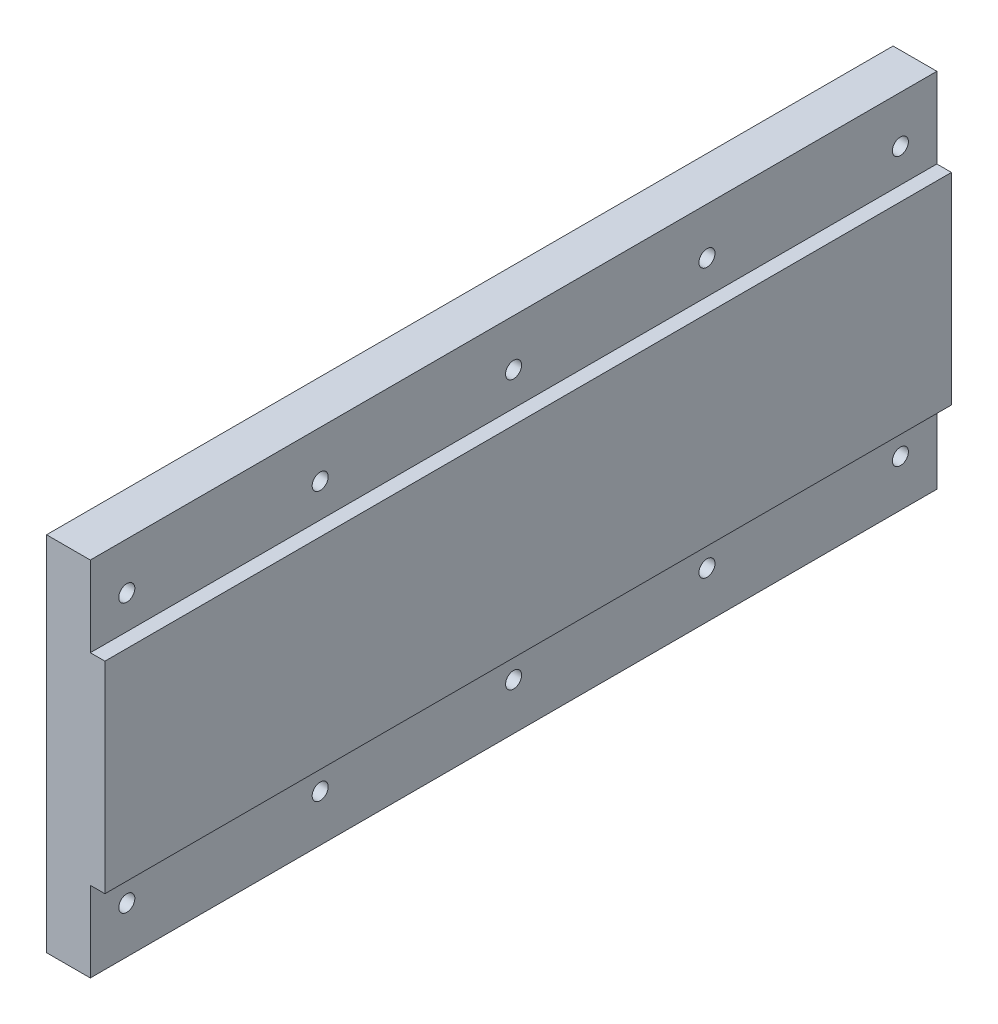
ISO-10303-21;
HEADER;
FILE_DESCRIPTION(('STEP AP214'),'2;1');
FILE_NAME('part.step','',(''),(''),'','','');
FILE_SCHEMA(('AUTOMOTIVE_DESIGN { 1 0 10303 214 1 1 1 1 }'));
ENDSEC;
DATA;
#1=APPLICATION_CONTEXT('core data for automotive mechanical design processes');
#2=APPLICATION_PROTOCOL_DEFINITION('international standard','automotive_design',2000,#1);
#3=PRODUCT_CONTEXT('',#1,'mechanical');
#4=PRODUCT('Part','Part','',(#3));
#5=PRODUCT_RELATED_PRODUCT_CATEGORY('part','',(#4));
#6=PRODUCT_DEFINITION_FORMATION('','',#4);
#7=PRODUCT_DEFINITION_CONTEXT('part definition',#1,'design');
#8=PRODUCT_DEFINITION('design','',#6,#7);
#9=PRODUCT_DEFINITION_SHAPE('','',#8);
#10=(LENGTH_UNIT() NAMED_UNIT(*) SI_UNIT(.MILLI.,.METRE.));
#11=(NAMED_UNIT(*) PLANE_ANGLE_UNIT() SI_UNIT($,.RADIAN.));
#12=(NAMED_UNIT(*) SI_UNIT($,.STERADIAN.) SOLID_ANGLE_UNIT());
#13=UNCERTAINTY_MEASURE_WITH_UNIT(LENGTH_MEASURE(1.E-05),#10,'distance_accuracy_value','');
#14=(GEOMETRIC_REPRESENTATION_CONTEXT(3) GLOBAL_UNCERTAINTY_ASSIGNED_CONTEXT((#13)) GLOBAL_UNIT_ASSIGNED_CONTEXT((#10,
#11,#12)) REPRESENTATION_CONTEXT('',''));
#15=CARTESIAN_POINT('',(0.,0.,0.));
#16=DIRECTION('',(0.,0.,1.));
#17=DIRECTION('',(1.,0.,0.));
#18=AXIS2_PLACEMENT_3D('',#15,#16,#17);
#19=CARTESIAN_POINT('',(0.,159.287393315112,290.));
#20=DIRECTION('',(0.,-1.,0.));
#21=DIRECTION('',(1.,0.,0.));
#22=AXIS2_PLACEMENT_3D('',#19,#20,#21);
#23=PLANE('',#22);
#24=DIRECTION('',(-1.,0.,0.));
#25=VECTOR('',#24,1.);
#26=CARTESIAN_POINT('',(0.,159.287393315112,-290.));
#27=LINE('',#26,#25);
#28=CARTESIAN_POINT('',(0.,159.287393315112,-290.));
#29=VERTEX_POINT('',#28);
#30=CARTESIAN_POINT('',(-30.,159.287393315112,-290.));
#31=VERTEX_POINT('',#30);
#32=EDGE_CURVE('E148',#29,#31,#27,.T.);
#33=ORIENTED_EDGE('',*,*,#32,.T.);
#34=DIRECTION('',(0.,0.,-1.));
#35=VECTOR('',#34,1.);
#36=CARTESIAN_POINT('',(-30.,159.287393315112,290.));
#37=LINE('',#36,#35);
#38=CARTESIAN_POINT('',(-30.,159.287393315112,290.));
#39=VERTEX_POINT('',#38);
#40=EDGE_CURVE('E11',#39,#31,#37,.T.);
#41=ORIENTED_EDGE('',*,*,#40,.F.);
#42=DIRECTION('',(-1.,0.,0.));
#43=VECTOR('',#42,1.);
#44=CARTESIAN_POINT('',(0.,159.287393315112,290.));
#45=LINE('',#44,#43);
#46=CARTESIAN_POINT('',(0.,159.287393315112,290.));
#47=VERTEX_POINT('',#46);
#48=EDGE_CURVE('E171',#47,#39,#45,.T.);
#49=ORIENTED_EDGE('',*,*,#48,.F.);
#50=DIRECTION('',(0.,0.,-1.));
#51=VECTOR('',#50,1.);
#52=CARTESIAN_POINT('',(0.,159.287393315112,290.));
#53=LINE('',#52,#51);
#54=EDGE_CURVE('E144',#47,#29,#53,.T.);
#55=ORIENTED_EDGE('',*,*,#54,.T.);
#56=EDGE_LOOP('',(#33,#41,#49,#55));
#57=FACE_BOUND('',#56,.T.);
#58=ADVANCED_FACE('F47',(#57),#23,.F.);
#59=CARTESIAN_POINT('',(-30.,159.287393315112,290.));
#60=DIRECTION('',(1.,0.,0.));
#61=DIRECTION('',(0.,1.,0.));
#62=AXIS2_PLACEMENT_3D('',#59,#60,#61);
#63=PLANE('',#62);
#64=CARTESIAN_POINT('',(-30.,127.287393315112,-265.));
#65=DIRECTION('',(-1.,0.,0.));
#66=DIRECTION('',(0.,0.,1.));
#67=AXIS2_PLACEMENT_3D('',#64,#65,#66);
#68=CIRCLE('',#67,11.5);
#69=CARTESIAN_POINT('',(-30.,127.287393315112,-253.5));
#70=VERTEX_POINT('',#69);
#71=EDGE_CURVE('E330',#70,#70,#68,.T.);
#72=ORIENTED_EDGE('',*,*,#71,.F.);
#73=EDGE_LOOP('',(#72));
#74=FACE_BOUND('',#73,.T.);
#75=CARTESIAN_POINT('',(-30.,127.287393315112,-132.5));
#76=DIRECTION('',(-1.,0.,0.));
#77=DIRECTION('',(0.,0.,1.));
#78=AXIS2_PLACEMENT_3D('',#75,#76,#77);
#79=CIRCLE('',#78,11.5);
#80=CARTESIAN_POINT('',(-30.,127.287393315112,-121.));
#81=VERTEX_POINT('',#80);
#82=EDGE_CURVE('E318',#81,#81,#79,.T.);
#83=ORIENTED_EDGE('',*,*,#82,.F.);
#84=EDGE_LOOP('',(#83));
#85=FACE_BOUND('',#84,.T.);
#86=CARTESIAN_POINT('',(-30.,127.287393315112,0.));
#87=DIRECTION('',(-1.,0.,0.));
#88=DIRECTION('',(0.,0.,1.));
#89=AXIS2_PLACEMENT_3D('',#86,#87,#88);
#90=CIRCLE('',#89,11.5);
#91=CARTESIAN_POINT('',(-30.,127.287393315112,11.5000000000001));
#92=VERTEX_POINT('',#91);
#93=EDGE_CURVE('E306',#92,#92,#90,.T.);
#94=ORIENTED_EDGE('',*,*,#93,.F.);
#95=EDGE_LOOP('',(#94));
#96=FACE_BOUND('',#95,.T.);
#97=CARTESIAN_POINT('',(-30.,127.287393315112,132.5));
#98=DIRECTION('',(-1.,0.,0.));
#99=DIRECTION('',(0.,0.,1.));
#100=AXIS2_PLACEMENT_3D('',#97,#98,#99);
#101=CIRCLE('',#100,11.5);
#102=CARTESIAN_POINT('',(-30.,127.287393315112,144.));
#103=VERTEX_POINT('',#102);
#104=EDGE_CURVE('E294',#103,#103,#101,.T.);
#105=ORIENTED_EDGE('',*,*,#104,.F.);
#106=EDGE_LOOP('',(#105));
#107=FACE_BOUND('',#106,.T.);
#108=CARTESIAN_POINT('',(-30.,127.287393315112,265.));
#109=DIRECTION('',(-1.,0.,0.));
#110=DIRECTION('',(0.,0.,1.));
#111=AXIS2_PLACEMENT_3D('',#108,#109,#110);
#112=CIRCLE('',#111,11.5);
#113=CARTESIAN_POINT('',(-30.,127.287393315112,276.5));
#114=VERTEX_POINT('',#113);
#115=EDGE_CURVE('E282',#114,#114,#112,.T.);
#116=ORIENTED_EDGE('',*,*,#115,.F.);
#117=EDGE_LOOP('',(#116));
#118=FACE_BOUND('',#117,.T.);
#119=CARTESIAN_POINT('',(-30.,-56.7126066848881,265.));
#120=DIRECTION('',(-1.,0.,0.));
#121=DIRECTION('',(0.,0.,1.));
#122=AXIS2_PLACEMENT_3D('',#119,#120,#121);
#123=CIRCLE('',#122,11.5);
#124=CARTESIAN_POINT('',(-30.,-56.7126066848881,276.5));
#125=VERTEX_POINT('',#124);
#126=EDGE_CURVE('E270',#125,#125,#123,.T.);
#127=ORIENTED_EDGE('',*,*,#126,.F.);
#128=EDGE_LOOP('',(#127));
#129=FACE_BOUND('',#128,.T.);
#130=CARTESIAN_POINT('',(-30.,-56.7126066848881,132.5));
#131=DIRECTION('',(-1.,0.,0.));
#132=DIRECTION('',(0.,0.,1.));
#133=AXIS2_PLACEMENT_3D('',#130,#131,#132);
#134=CIRCLE('',#133,11.5);
#135=CARTESIAN_POINT('',(-30.,-56.7126066848881,144.));
#136=VERTEX_POINT('',#135);
#137=EDGE_CURVE('E258',#136,#136,#134,.T.);
#138=ORIENTED_EDGE('',*,*,#137,.F.);
#139=EDGE_LOOP('',(#138));
#140=FACE_BOUND('',#139,.T.);
#141=CARTESIAN_POINT('',(-30.,-56.7126066848881,0.));
#142=DIRECTION('',(-1.,0.,0.));
#143=DIRECTION('',(0.,0.,1.));
#144=AXIS2_PLACEMENT_3D('',#141,#142,#143);
#145=CIRCLE('',#144,11.5);
#146=CARTESIAN_POINT('',(-30.,-56.7126066848881,11.5000000000001));
#147=VERTEX_POINT('',#146);
#148=EDGE_CURVE('E246',#147,#147,#145,.T.);
#149=ORIENTED_EDGE('',*,*,#148,.F.);
#150=EDGE_LOOP('',(#149));
#151=FACE_BOUND('',#150,.T.);
#152=CARTESIAN_POINT('',(-30.,-56.7126066848881,-132.5));
#153=DIRECTION('',(-1.,0.,0.));
#154=DIRECTION('',(0.,0.,1.));
#155=AXIS2_PLACEMENT_3D('',#152,#153,#154);
#156=CIRCLE('',#155,11.5);
#157=CARTESIAN_POINT('',(-30.,-56.7126066848881,-121.));
#158=VERTEX_POINT('',#157);
#159=EDGE_CURVE('E234',#158,#158,#156,.T.);
#160=ORIENTED_EDGE('',*,*,#159,.F.);
#161=EDGE_LOOP('',(#160));
#162=FACE_BOUND('',#161,.T.);
#163=CARTESIAN_POINT('',(-30.,-56.7126066848881,-265.));
#164=DIRECTION('',(-1.,0.,0.));
#165=DIRECTION('',(0.,0.,1.));
#166=AXIS2_PLACEMENT_3D('',#163,#164,#165);
#167=CIRCLE('',#166,11.5);
#168=CARTESIAN_POINT('',(-30.,-56.7126066848881,-253.5));
#169=VERTEX_POINT('',#168);
#170=EDGE_CURVE('E222',#169,#169,#167,.T.);
#171=ORIENTED_EDGE('',*,*,#170,.F.);
#172=EDGE_LOOP('',(#171));
#173=FACE_BOUND('',#172,.T.);
#174=DIRECTION('',(0.,-1.,0.));
#175=VECTOR('',#174,1.);
#176=CARTESIAN_POINT('',(-30.,159.287393315112,-290.));
#177=LINE('',#176,#175);
#178=CARTESIAN_POINT('',(-30.,-88.7126066848881,-290.));
#179=VERTEX_POINT('',#178);
#180=EDGE_CURVE('E152',#31,#179,#177,.T.);
#181=ORIENTED_EDGE('',*,*,#180,.T.);
#182=DIRECTION('',(0.,0.,-1.));
#183=VECTOR('',#182,1.);
#184=CARTESIAN_POINT('',(-30.,-88.7126066848881,290.));
#185=LINE('',#184,#183);
#186=CARTESIAN_POINT('',(-30.,-88.7126066848881,290.));
#187=VERTEX_POINT('',#186);
#188=EDGE_CURVE('E56',#187,#179,#185,.T.);
#189=ORIENTED_EDGE('',*,*,#188,.F.);
#190=DIRECTION('',(0.,-1.,0.));
#191=VECTOR('',#190,1.);
#192=CARTESIAN_POINT('',(-30.,159.287393315112,290.));
#193=LINE('',#192,#191);
#194=EDGE_CURVE('E107',#39,#187,#193,.T.);
#195=ORIENTED_EDGE('',*,*,#194,.F.);
#196=ORIENTED_EDGE('',*,*,#40,.T.);
#197=EDGE_LOOP('',(#181,#189,#195,#196));
#198=FACE_BOUND('',#197,.T.);
#199=ADVANCED_FACE('F337',(#74,#85,#96,#107,#118,#129,#140,#151,#162,#173,#198),#63,.F.);
#200=CARTESIAN_POINT('',(-30.,-88.7126066848881,290.));
#201=DIRECTION('',(0.,1.,0.));
#202=DIRECTION('',(-1.,0.,0.));
#203=AXIS2_PLACEMENT_3D('',#200,#201,#202);
#204=PLANE('',#203);
#205=DIRECTION('',(1.,0.,0.));
#206=VECTOR('',#205,1.);
#207=CARTESIAN_POINT('',(-30.,-88.7126066848881,-290.));
#208=LINE('',#207,#206);
#209=CARTESIAN_POINT('',(0.,-88.712606684888,-290.));
#210=VERTEX_POINT('',#209);
#211=EDGE_CURVE('E156',#179,#210,#208,.T.);
#212=ORIENTED_EDGE('',*,*,#211,.T.);
#213=DIRECTION('',(0.,0.,-1.));
#214=VECTOR('',#213,1.);
#215=CARTESIAN_POINT('',(0.,-88.712606684888,290.));
#216=LINE('',#215,#214);
#217=CARTESIAN_POINT('',(0.,-88.712606684888,290.));
#218=VERTEX_POINT('',#217);
#219=EDGE_CURVE('E182',#218,#210,#216,.T.);
#220=ORIENTED_EDGE('',*,*,#219,.F.);
#221=DIRECTION('',(1.,0.,0.));
#222=VECTOR('',#221,1.);
#223=CARTESIAN_POINT('',(-30.,-88.7126066848881,290.));
#224=LINE('',#223,#222);
#225=EDGE_CURVE('E192',#187,#218,#224,.T.);
#226=ORIENTED_EDGE('',*,*,#225,.F.);
#227=ORIENTED_EDGE('',*,*,#188,.T.);
#228=EDGE_LOOP('',(#212,#220,#226,#227));
#229=FACE_BOUND('',#228,.T.);
#230=ADVANCED_FACE('F190',(#229),#204,.F.);
#231=CARTESIAN_POINT('',(0.,-88.712606684888,290.));
#232=DIRECTION('',(-1.,0.,0.));
#233=DIRECTION('',(0.,0.,1.));
#234=AXIS2_PLACEMENT_3D('',#231,#232,#233);
#235=PLANE('',#234);
#236=CARTESIAN_POINT('',(0.,-56.7126066848881,265.));
#237=DIRECTION('',(-1.,0.,0.));
#238=DIRECTION('',(0.,0.,1.));
#239=AXIS2_PLACEMENT_3D('',#236,#237,#238);
#240=CIRCLE('',#239,5.49999999999998);
#241=CARTESIAN_POINT('',(0.,-56.7126066848881,270.5));
#242=VERTEX_POINT('',#241);
#243=EDGE_CURVE('E262',#242,#242,#240,.T.);
#244=ORIENTED_EDGE('',*,*,#243,.T.);
#245=EDGE_LOOP('',(#244));
#246=FACE_BOUND('',#245,.T.);
#247=CARTESIAN_POINT('',(0.,-56.7126066848881,132.5));
#248=DIRECTION('',(-1.,0.,0.));
#249=DIRECTION('',(0.,0.,1.));
#250=AXIS2_PLACEMENT_3D('',#247,#248,#249);
#251=CIRCLE('',#250,5.49999999999998);
#252=CARTESIAN_POINT('',(0.,-56.7126066848881,138.));
#253=VERTEX_POINT('',#252);
#254=EDGE_CURVE('E250',#253,#253,#251,.T.);
#255=ORIENTED_EDGE('',*,*,#254,.T.);
#256=EDGE_LOOP('',(#255));
#257=FACE_BOUND('',#256,.T.);
#258=CARTESIAN_POINT('',(0.,-56.7126066848881,0.));
#259=DIRECTION('',(-1.,0.,0.));
#260=DIRECTION('',(0.,0.,1.));
#261=AXIS2_PLACEMENT_3D('',#258,#259,#260);
#262=CIRCLE('',#261,5.49999999999998);
#263=CARTESIAN_POINT('',(0.,-56.7126066848881,5.50000000000004));
#264=VERTEX_POINT('',#263);
#265=EDGE_CURVE('E238',#264,#264,#262,.T.);
#266=ORIENTED_EDGE('',*,*,#265,.T.);
#267=EDGE_LOOP('',(#266));
#268=FACE_BOUND('',#267,.T.);
#269=CARTESIAN_POINT('',(0.,-56.7126066848881,-132.5));
#270=DIRECTION('',(-1.,0.,0.));
#271=DIRECTION('',(0.,0.,1.));
#272=AXIS2_PLACEMENT_3D('',#269,#270,#271);
#273=CIRCLE('',#272,5.49999999999998);
#274=CARTESIAN_POINT('',(0.,-56.7126066848881,-127.));
#275=VERTEX_POINT('',#274);
#276=EDGE_CURVE('E226',#275,#275,#273,.T.);
#277=ORIENTED_EDGE('',*,*,#276,.T.);
#278=EDGE_LOOP('',(#277));
#279=FACE_BOUND('',#278,.T.);
#280=CARTESIAN_POINT('',(0.,-56.7126066848881,-265.));
#281=DIRECTION('',(-1.,0.,0.));
#282=DIRECTION('',(0.,0.,1.));
#283=AXIS2_PLACEMENT_3D('',#280,#281,#282);
#284=CIRCLE('',#283,5.49999999999998);
#285=CARTESIAN_POINT('',(0.,-56.7126066848881,-259.5));
#286=VERTEX_POINT('',#285);
#287=EDGE_CURVE('E153',#286,#286,#284,.T.);
#288=ORIENTED_EDGE('',*,*,#287,.T.);
#289=EDGE_LOOP('',(#288));
#290=FACE_BOUND('',#289,.T.);
#291=DIRECTION('',(0.,1.,0.));
#292=VECTOR('',#291,1.);
#293=CARTESIAN_POINT('',(0.,-88.712606684888,-290.));
#294=LINE('',#293,#292);
#295=CARTESIAN_POINT('',(0.,-33.7126066848881,-290.));
#296=VERTEX_POINT('',#295);
#297=EDGE_CURVE('E159',#210,#296,#294,.T.);
#298=ORIENTED_EDGE('',*,*,#297,.T.);
#299=DIRECTION('',(0.,0.,-1.));
#300=VECTOR('',#299,1.);
#301=CARTESIAN_POINT('',(0.,-33.7126066848881,290.));
#302=LINE('',#301,#300);
#303=CARTESIAN_POINT('',(0.,-33.7126066848881,290.));
#304=VERTEX_POINT('',#303);
#305=EDGE_CURVE('E178',#304,#296,#302,.T.);
#306=ORIENTED_EDGE('',*,*,#305,.F.);
#307=DIRECTION('',(0.,1.,0.));
#308=VECTOR('',#307,1.);
#309=CARTESIAN_POINT('',(0.,-88.712606684888,290.));
#310=LINE('',#309,#308);
#311=EDGE_CURVE('E205',#218,#304,#310,.T.);
#312=ORIENTED_EDGE('',*,*,#311,.F.);
#313=ORIENTED_EDGE('',*,*,#219,.T.);
#314=EDGE_LOOP('',(#298,#306,#312,#313));
#315=FACE_BOUND('',#314,.T.);
#316=ADVANCED_FACE('F200',(#246,#257,#268,#279,#290,#315),#235,.F.);
#317=CARTESIAN_POINT('',(0.,-33.7126066848881,290.));
#318=DIRECTION('',(0.,1.,0.));
#319=DIRECTION('',(-1.,0.,0.));
#320=AXIS2_PLACEMENT_3D('',#317,#318,#319);
#321=PLANE('',#320);
#322=DIRECTION('',(1.,0.,0.));
#323=VECTOR('',#322,1.);
#324=CARTESIAN_POINT('',(0.,-33.7126066848881,-290.));
#325=LINE('',#324,#323);
#326=CARTESIAN_POINT('',(10.,-33.7126066848881,-290.));
#327=VERTEX_POINT('',#326);
#328=EDGE_CURVE('E162',#296,#327,#325,.T.);
#329=ORIENTED_EDGE('',*,*,#328,.T.);
#330=DIRECTION('',(0.,0.,-1.));
#331=VECTOR('',#330,1.);
#332=CARTESIAN_POINT('',(10.,-33.7126066848881,290.));
#333=LINE('',#332,#331);
#334=CARTESIAN_POINT('',(10.,-33.7126066848881,290.));
#335=VERTEX_POINT('',#334);
#336=EDGE_CURVE('E137',#335,#327,#333,.T.);
#337=ORIENTED_EDGE('',*,*,#336,.F.);
#338=DIRECTION('',(1.,0.,0.));
#339=VECTOR('',#338,1.);
#340=CARTESIAN_POINT('',(0.,-33.7126066848881,290.));
#341=LINE('',#340,#339);
#342=EDGE_CURVE('E126',#304,#335,#341,.T.);
#343=ORIENTED_EDGE('',*,*,#342,.F.);
#344=ORIENTED_EDGE('',*,*,#305,.T.);
#345=EDGE_LOOP('',(#329,#337,#343,#344));
#346=FACE_BOUND('',#345,.T.);
#347=ADVANCED_FACE('F203',(#346),#321,.F.);
#348=CARTESIAN_POINT('',(10.,-33.7126066848881,290.));
#349=DIRECTION('',(-1.,0.,0.));
#350=DIRECTION('',(0.,0.,1.));
#351=AXIS2_PLACEMENT_3D('',#348,#349,#350);
#352=PLANE('',#351);
#353=DIRECTION('',(0.,1.,0.));
#354=VECTOR('',#353,1.);
#355=CARTESIAN_POINT('',(10.,-33.7126066848881,-290.));
#356=LINE('',#355,#354);
#357=CARTESIAN_POINT('',(10.,104.287393315112,-290.));
#358=VERTEX_POINT('',#357);
#359=EDGE_CURVE('E135',#327,#358,#356,.T.);
#360=ORIENTED_EDGE('',*,*,#359,.T.);
#361=DIRECTION('',(0.,0.,-1.));
#362=VECTOR('',#361,1.);
#363=CARTESIAN_POINT('',(10.,104.287393315112,290.));
#364=LINE('',#363,#362);
#365=CARTESIAN_POINT('',(10.,104.287393315112,290.));
#366=VERTEX_POINT('',#365);
#367=EDGE_CURVE('E132',#366,#358,#364,.T.);
#368=ORIENTED_EDGE('',*,*,#367,.F.);
#369=DIRECTION('',(0.,1.,0.));
#370=VECTOR('',#369,1.);
#371=CARTESIAN_POINT('',(10.,-33.7126066848881,290.));
#372=LINE('',#371,#370);
#373=EDGE_CURVE('E120',#335,#366,#372,.T.);
#374=ORIENTED_EDGE('',*,*,#373,.F.);
#375=ORIENTED_EDGE('',*,*,#336,.T.);
#376=EDGE_LOOP('',(#360,#368,#374,#375));
#377=FACE_BOUND('',#376,.T.);
#378=ADVANCED_FACE('F133',(#377),#352,.F.);
#379=CARTESIAN_POINT('',(10.,104.287393315112,290.));
#380=DIRECTION('',(0.,-1.,0.));
#381=DIRECTION('',(1.,0.,0.));
#382=AXIS2_PLACEMENT_3D('',#379,#380,#381);
#383=PLANE('',#382);
#384=DIRECTION('',(-1.,0.,0.));
#385=VECTOR('',#384,1.);
#386=CARTESIAN_POINT('',(10.,104.287393315112,-290.));
#387=LINE('',#386,#385);
#388=CARTESIAN_POINT('',(0.,104.287393315112,-290.));
#389=VERTEX_POINT('',#388);
#390=EDGE_CURVE('E93',#358,#389,#387,.T.);
#391=ORIENTED_EDGE('',*,*,#390,.T.);
#392=DIRECTION('',(0.,0.,-1.));
#393=VECTOR('',#392,1.);
#394=CARTESIAN_POINT('',(0.,104.287393315112,290.));
#395=LINE('',#394,#393);
#396=CARTESIAN_POINT('',(0.,104.287393315112,290.));
#397=VERTEX_POINT('',#396);
#398=EDGE_CURVE('E138',#397,#389,#395,.T.);
#399=ORIENTED_EDGE('',*,*,#398,.F.);
#400=DIRECTION('',(-1.,0.,0.));
#401=VECTOR('',#400,1.);
#402=CARTESIAN_POINT('',(10.,104.287393315112,290.));
#403=LINE('',#402,#401);
#404=EDGE_CURVE('E124',#366,#397,#403,.T.);
#405=ORIENTED_EDGE('',*,*,#404,.F.);
#406=ORIENTED_EDGE('',*,*,#367,.T.);
#407=EDGE_LOOP('',(#391,#399,#405,#406));
#408=FACE_BOUND('',#407,.T.);
#409=ADVANCED_FACE('F140',(#408),#383,.F.);
#410=CARTESIAN_POINT('',(0.,104.287393315112,290.));
#411=DIRECTION('',(-1.,0.,0.));
#412=DIRECTION('',(0.,0.,1.));
#413=AXIS2_PLACEMENT_3D('',#410,#411,#412);
#414=PLANE('',#413);
#415=CARTESIAN_POINT('',(0.,127.287393315112,-265.));
#416=DIRECTION('',(-1.,0.,0.));
#417=DIRECTION('',(0.,0.,1.));
#418=AXIS2_PLACEMENT_3D('',#415,#416,#417);
#419=CIRCLE('',#418,5.49999999999998);
#420=CARTESIAN_POINT('',(0.,127.287393315112,-259.5));
#421=VERTEX_POINT('',#420);
#422=EDGE_CURVE('E322',#421,#421,#419,.T.);
#423=ORIENTED_EDGE('',*,*,#422,.T.);
#424=EDGE_LOOP('',(#423));
#425=FACE_BOUND('',#424,.T.);
#426=CARTESIAN_POINT('',(0.,127.287393315112,-132.5));
#427=DIRECTION('',(-1.,0.,0.));
#428=DIRECTION('',(0.,0.,1.));
#429=AXIS2_PLACEMENT_3D('',#426,#427,#428);
#430=CIRCLE('',#429,5.49999999999998);
#431=CARTESIAN_POINT('',(0.,127.287393315112,-127.));
#432=VERTEX_POINT('',#431);
#433=EDGE_CURVE('E310',#432,#432,#430,.T.);
#434=ORIENTED_EDGE('',*,*,#433,.T.);
#435=EDGE_LOOP('',(#434));
#436=FACE_BOUND('',#435,.T.);
#437=CARTESIAN_POINT('',(0.,127.287393315112,0.));
#438=DIRECTION('',(-1.,0.,0.));
#439=DIRECTION('',(0.,0.,1.));
#440=AXIS2_PLACEMENT_3D('',#437,#438,#439);
#441=CIRCLE('',#440,5.49999999999998);
#442=CARTESIAN_POINT('',(0.,127.287393315112,5.50000000000003));
#443=VERTEX_POINT('',#442);
#444=EDGE_CURVE('E298',#443,#443,#441,.T.);
#445=ORIENTED_EDGE('',*,*,#444,.T.);
#446=EDGE_LOOP('',(#445));
#447=FACE_BOUND('',#446,.T.);
#448=CARTESIAN_POINT('',(0.,127.287393315112,132.5));
#449=DIRECTION('',(-1.,0.,0.));
#450=DIRECTION('',(0.,0.,1.));
#451=AXIS2_PLACEMENT_3D('',#448,#449,#450);
#452=CIRCLE('',#451,5.49999999999998);
#453=CARTESIAN_POINT('',(0.,127.287393315112,138.));
#454=VERTEX_POINT('',#453);
#455=EDGE_CURVE('E286',#454,#454,#452,.T.);
#456=ORIENTED_EDGE('',*,*,#455,.T.);
#457=EDGE_LOOP('',(#456));
#458=FACE_BOUND('',#457,.T.);
#459=CARTESIAN_POINT('',(0.,127.287393315112,265.));
#460=DIRECTION('',(-1.,0.,0.));
#461=DIRECTION('',(0.,0.,1.));
#462=AXIS2_PLACEMENT_3D('',#459,#460,#461);
#463=CIRCLE('',#462,5.49999999999998);
#464=CARTESIAN_POINT('',(0.,127.287393315112,270.5));
#465=VERTEX_POINT('',#464);
#466=EDGE_CURVE('E274',#465,#465,#463,.T.);
#467=ORIENTED_EDGE('',*,*,#466,.T.);
#468=EDGE_LOOP('',(#467));
#469=FACE_BOUND('',#468,.T.);
#470=DIRECTION('',(0.,1.,0.));
#471=VECTOR('',#470,1.);
#472=CARTESIAN_POINT('',(0.,104.287393315112,-290.));
#473=LINE('',#472,#471);
#474=EDGE_CURVE('E99',#389,#29,#473,.T.);
#475=ORIENTED_EDGE('',*,*,#474,.T.);
#476=ORIENTED_EDGE('',*,*,#54,.F.);
#477=DIRECTION('',(0.,1.,0.));
#478=VECTOR('',#477,1.);
#479=CARTESIAN_POINT('',(0.,104.287393315112,290.));
#480=LINE('',#479,#478);
#481=EDGE_CURVE('E64',#397,#47,#480,.T.);
#482=ORIENTED_EDGE('',*,*,#481,.F.);
#483=ORIENTED_EDGE('',*,*,#398,.T.);
#484=EDGE_LOOP('',(#475,#476,#482,#483));
#485=FACE_BOUND('',#484,.T.);
#486=ADVANCED_FACE('F360',(#425,#436,#447,#458,#469,#485),#414,.F.);
#487=CARTESIAN_POINT('',(0.,0.,290.));
#488=DIRECTION('',(0.,0.,1.));
#489=DIRECTION('',(1.,0.,0.));
#490=AXIS2_PLACEMENT_3D('',#487,#488,#489);
#491=PLANE('',#490);
#492=ORIENTED_EDGE('',*,*,#48,.T.);
#493=ORIENTED_EDGE('',*,*,#194,.T.);
#494=ORIENTED_EDGE('',*,*,#225,.T.);
#495=ORIENTED_EDGE('',*,*,#311,.T.);
#496=ORIENTED_EDGE('',*,*,#342,.T.);
#497=ORIENTED_EDGE('',*,*,#373,.T.);
#498=ORIENTED_EDGE('',*,*,#404,.T.);
#499=ORIENTED_EDGE('',*,*,#481,.T.);
#500=EDGE_LOOP('',(#492,#493,#494,#495,#496,#497,#498,#499));
#501=FACE_BOUND('',#500,.T.);
#502=ADVANCED_FACE('F122',(#501),#491,.T.);
#503=CARTESIAN_POINT('',(0.,0.,-290.));
#504=DIRECTION('',(0.,0.,1.));
#505=DIRECTION('',(1.,0.,0.));
#506=AXIS2_PLACEMENT_3D('',#503,#504,#505);
#507=PLANE('',#506);
#508=ORIENTED_EDGE('',*,*,#32,.F.);
#509=ORIENTED_EDGE('',*,*,#474,.F.);
#510=ORIENTED_EDGE('',*,*,#390,.F.);
#511=ORIENTED_EDGE('',*,*,#359,.F.);
#512=ORIENTED_EDGE('',*,*,#328,.F.);
#513=ORIENTED_EDGE('',*,*,#297,.F.);
#514=ORIENTED_EDGE('',*,*,#211,.F.);
#515=ORIENTED_EDGE('',*,*,#180,.F.);
#516=EDGE_LOOP('',(#508,#509,#510,#511,#512,#513,#514,#515));
#517=FACE_BOUND('',#516,.T.);
#518=ADVANCED_FACE('F196',(#517),#507,.F.);
#519=CARTESIAN_POINT('',(-30.,-56.7126066848881,-265.));
#520=DIRECTION('',(-1.,0.,0.));
#521=DIRECTION('',(0.,0.,1.));
#522=AXIS2_PLACEMENT_3D('',#519,#520,#521);
#523=CYLINDRICAL_SURFACE('',#522,5.49999999999999);
#524=ORIENTED_EDGE('',*,*,#287,.F.);
#525=EDGE_LOOP('',(#524));
#526=FACE_BOUND('',#525,.T.);
#527=CARTESIAN_POINT('',(-24.,-56.7126066848881,-265.));
#528=DIRECTION('',(-1.,0.,0.));
#529=DIRECTION('',(0.,0.,1.));
#530=AXIS2_PLACEMENT_3D('',#527,#528,#529);
#531=CIRCLE('',#530,5.5);
#532=CARTESIAN_POINT('',(-24.,-56.7126066848881,-259.5));
#533=VERTEX_POINT('',#532);
#534=EDGE_CURVE('E218',#533,#533,#531,.T.);
#535=ORIENTED_EDGE('',*,*,#534,.T.);
#536=EDGE_LOOP('',(#535));
#537=FACE_BOUND('',#536,.T.);
#538=ADVANCED_FACE('F416',(#526,#537),#523,.F.);
#539=CARTESIAN_POINT('',(-30.,-56.7126066848881,-265.));
#540=DIRECTION('',(-1.,0.,0.));
#541=DIRECTION('',(0.,0.,1.));
#542=AXIS2_PLACEMENT_3D('',#539,#540,#541);
#543=CONICAL_SURFACE('',#542,11.5,0.785398163397449);
#544=ORIENTED_EDGE('',*,*,#534,.F.);
#545=EDGE_LOOP('',(#544));
#546=FACE_BOUND('',#545,.T.);
#547=ORIENTED_EDGE('',*,*,#170,.T.);
#548=EDGE_LOOP('',(#547));
#549=FACE_BOUND('',#548,.T.);
#550=ADVANCED_FACE('F445',(#546,#549),#543,.F.);
#551=CARTESIAN_POINT('',(-30.,-56.7126066848881,-132.5));
#552=DIRECTION('',(-1.,0.,0.));
#553=DIRECTION('',(0.,0.,1.));
#554=AXIS2_PLACEMENT_3D('',#551,#552,#553);
#555=CYLINDRICAL_SURFACE('',#554,5.49999999999999);
#556=ORIENTED_EDGE('',*,*,#276,.F.);
#557=EDGE_LOOP('',(#556));
#558=FACE_BOUND('',#557,.T.);
#559=CARTESIAN_POINT('',(-24.,-56.7126066848881,-132.5));
#560=DIRECTION('',(-1.,0.,0.));
#561=DIRECTION('',(0.,0.,1.));
#562=AXIS2_PLACEMENT_3D('',#559,#560,#561);
#563=CIRCLE('',#562,5.5);
#564=CARTESIAN_POINT('',(-24.,-56.7126066848881,-127.));
#565=VERTEX_POINT('',#564);
#566=EDGE_CURVE('E230',#565,#565,#563,.T.);
#567=ORIENTED_EDGE('',*,*,#566,.T.);
#568=EDGE_LOOP('',(#567));
#569=FACE_BOUND('',#568,.T.);
#570=ADVANCED_FACE('F454',(#558,#569),#555,.F.);
#571=CARTESIAN_POINT('',(-30.,-56.7126066848881,-132.5));
#572=DIRECTION('',(-1.,0.,0.));
#573=DIRECTION('',(0.,0.,1.));
#574=AXIS2_PLACEMENT_3D('',#571,#572,#573);
#575=CONICAL_SURFACE('',#574,11.5,0.785398163397449);
#576=ORIENTED_EDGE('',*,*,#566,.F.);
#577=EDGE_LOOP('',(#576));
#578=FACE_BOUND('',#577,.T.);
#579=ORIENTED_EDGE('',*,*,#159,.T.);
#580=EDGE_LOOP('',(#579));
#581=FACE_BOUND('',#580,.T.);
#582=ADVANCED_FACE('F463',(#578,#581),#575,.F.);
#583=CARTESIAN_POINT('',(-30.,-56.7126066848881,0.));
#584=DIRECTION('',(-1.,0.,0.));
#585=DIRECTION('',(0.,0.,1.));
#586=AXIS2_PLACEMENT_3D('',#583,#584,#585);
#587=CYLINDRICAL_SURFACE('',#586,5.49999999999999);
#588=ORIENTED_EDGE('',*,*,#265,.F.);
#589=EDGE_LOOP('',(#588));
#590=FACE_BOUND('',#589,.T.);
#591=CARTESIAN_POINT('',(-24.,-56.7126066848881,0.));
#592=DIRECTION('',(-1.,0.,0.));
#593=DIRECTION('',(0.,0.,1.));
#594=AXIS2_PLACEMENT_3D('',#591,#592,#593);
#595=CIRCLE('',#594,5.5);
#596=CARTESIAN_POINT('',(-24.,-56.7126066848881,5.50000000000005));
#597=VERTEX_POINT('',#596);
#598=EDGE_CURVE('E242',#597,#597,#595,.T.);
#599=ORIENTED_EDGE('',*,*,#598,.T.);
#600=EDGE_LOOP('',(#599));
#601=FACE_BOUND('',#600,.T.);
#602=ADVANCED_FACE('F472',(#590,#601),#587,.F.);
#603=CARTESIAN_POINT('',(-30.,-56.7126066848881,0.));
#604=DIRECTION('',(-1.,0.,0.));
#605=DIRECTION('',(0.,0.,1.));
#606=AXIS2_PLACEMENT_3D('',#603,#604,#605);
#607=CONICAL_SURFACE('',#606,11.5,0.785398163397449);
#608=ORIENTED_EDGE('',*,*,#598,.F.);
#609=EDGE_LOOP('',(#608));
#610=FACE_BOUND('',#609,.T.);
#611=ORIENTED_EDGE('',*,*,#148,.T.);
#612=EDGE_LOOP('',(#611));
#613=FACE_BOUND('',#612,.T.);
#614=ADVANCED_FACE('F481',(#610,#613),#607,.F.);
#615=CARTESIAN_POINT('',(-30.,-56.7126066848881,132.5));
#616=DIRECTION('',(-1.,0.,0.));
#617=DIRECTION('',(0.,0.,1.));
#618=AXIS2_PLACEMENT_3D('',#615,#616,#617);
#619=CYLINDRICAL_SURFACE('',#618,5.49999999999999);
#620=ORIENTED_EDGE('',*,*,#254,.F.);
#621=EDGE_LOOP('',(#620));
#622=FACE_BOUND('',#621,.T.);
#623=CARTESIAN_POINT('',(-24.,-56.7126066848881,132.5));
#624=DIRECTION('',(-1.,0.,0.));
#625=DIRECTION('',(0.,0.,1.));
#626=AXIS2_PLACEMENT_3D('',#623,#624,#625);
#627=CIRCLE('',#626,5.5);
#628=CARTESIAN_POINT('',(-24.,-56.7126066848881,138.));
#629=VERTEX_POINT('',#628);
#630=EDGE_CURVE('E254',#629,#629,#627,.T.);
#631=ORIENTED_EDGE('',*,*,#630,.T.);
#632=EDGE_LOOP('',(#631));
#633=FACE_BOUND('',#632,.T.);
#634=ADVANCED_FACE('F490',(#622,#633),#619,.F.);
#635=CARTESIAN_POINT('',(-30.,-56.7126066848881,132.5));
#636=DIRECTION('',(-1.,0.,0.));
#637=DIRECTION('',(0.,0.,1.));
#638=AXIS2_PLACEMENT_3D('',#635,#636,#637);
#639=CONICAL_SURFACE('',#638,11.5,0.785398163397449);
#640=ORIENTED_EDGE('',*,*,#630,.F.);
#641=EDGE_LOOP('',(#640));
#642=FACE_BOUND('',#641,.T.);
#643=ORIENTED_EDGE('',*,*,#137,.T.);
#644=EDGE_LOOP('',(#643));
#645=FACE_BOUND('',#644,.T.);
#646=ADVANCED_FACE('F499',(#642,#645),#639,.F.);
#647=CARTESIAN_POINT('',(-30.,-56.7126066848881,265.));
#648=DIRECTION('',(-1.,0.,0.));
#649=DIRECTION('',(0.,0.,1.));
#650=AXIS2_PLACEMENT_3D('',#647,#648,#649);
#651=CYLINDRICAL_SURFACE('',#650,5.49999999999999);
#652=ORIENTED_EDGE('',*,*,#243,.F.);
#653=EDGE_LOOP('',(#652));
#654=FACE_BOUND('',#653,.T.);
#655=CARTESIAN_POINT('',(-24.,-56.7126066848881,265.));
#656=DIRECTION('',(-1.,0.,0.));
#657=DIRECTION('',(0.,0.,1.));
#658=AXIS2_PLACEMENT_3D('',#655,#656,#657);
#659=CIRCLE('',#658,5.5);
#660=CARTESIAN_POINT('',(-24.,-56.7126066848881,270.5));
#661=VERTEX_POINT('',#660);
#662=EDGE_CURVE('E266',#661,#661,#659,.T.);
#663=ORIENTED_EDGE('',*,*,#662,.T.);
#664=EDGE_LOOP('',(#663));
#665=FACE_BOUND('',#664,.T.);
#666=ADVANCED_FACE('F508',(#654,#665),#651,.F.);
#667=CARTESIAN_POINT('',(-30.,-56.7126066848881,265.));
#668=DIRECTION('',(-1.,0.,0.));
#669=DIRECTION('',(0.,0.,1.));
#670=AXIS2_PLACEMENT_3D('',#667,#668,#669);
#671=CONICAL_SURFACE('',#670,11.5,0.785398163397449);
#672=ORIENTED_EDGE('',*,*,#662,.F.);
#673=EDGE_LOOP('',(#672));
#674=FACE_BOUND('',#673,.T.);
#675=ORIENTED_EDGE('',*,*,#126,.T.);
#676=EDGE_LOOP('',(#675));
#677=FACE_BOUND('',#676,.T.);
#678=ADVANCED_FACE('F517',(#674,#677),#671,.F.);
#679=CARTESIAN_POINT('',(-30.,127.287393315112,265.));
#680=DIRECTION('',(-1.,0.,0.));
#681=DIRECTION('',(0.,0.,1.));
#682=AXIS2_PLACEMENT_3D('',#679,#680,#681);
#683=CYLINDRICAL_SURFACE('',#682,5.49999999999999);
#684=ORIENTED_EDGE('',*,*,#466,.F.);
#685=EDGE_LOOP('',(#684));
#686=FACE_BOUND('',#685,.T.);
#687=CARTESIAN_POINT('',(-24.,127.287393315112,265.));
#688=DIRECTION('',(-1.,0.,0.));
#689=DIRECTION('',(0.,0.,1.));
#690=AXIS2_PLACEMENT_3D('',#687,#688,#689);
#691=CIRCLE('',#690,5.50000000000001);
#692=CARTESIAN_POINT('',(-24.,127.287393315112,270.5));
#693=VERTEX_POINT('',#692);
#694=EDGE_CURVE('E278',#693,#693,#691,.T.);
#695=ORIENTED_EDGE('',*,*,#694,.T.);
#696=EDGE_LOOP('',(#695));
#697=FACE_BOUND('',#696,.T.);
#698=ADVANCED_FACE('F526',(#686,#697),#683,.F.);
#699=CARTESIAN_POINT('',(-30.,127.287393315112,265.));
#700=DIRECTION('',(-1.,0.,0.));
#701=DIRECTION('',(0.,0.,1.));
#702=AXIS2_PLACEMENT_3D('',#699,#700,#701);
#703=CONICAL_SURFACE('',#702,11.5,0.785398163397449);
#704=ORIENTED_EDGE('',*,*,#694,.F.);
#705=EDGE_LOOP('',(#704));
#706=FACE_BOUND('',#705,.T.);
#707=ORIENTED_EDGE('',*,*,#115,.T.);
#708=EDGE_LOOP('',(#707));
#709=FACE_BOUND('',#708,.T.);
#710=ADVANCED_FACE('F535',(#706,#709),#703,.F.);
#711=CARTESIAN_POINT('',(-30.,127.287393315112,132.5));
#712=DIRECTION('',(-1.,0.,0.));
#713=DIRECTION('',(0.,0.,1.));
#714=AXIS2_PLACEMENT_3D('',#711,#712,#713);
#715=CYLINDRICAL_SURFACE('',#714,5.49999999999999);
#716=ORIENTED_EDGE('',*,*,#455,.F.);
#717=EDGE_LOOP('',(#716));
#718=FACE_BOUND('',#717,.T.);
#719=CARTESIAN_POINT('',(-24.,127.287393315112,132.5));
#720=DIRECTION('',(-1.,0.,0.));
#721=DIRECTION('',(0.,0.,1.));
#722=AXIS2_PLACEMENT_3D('',#719,#720,#721);
#723=CIRCLE('',#722,5.50000000000001);
#724=CARTESIAN_POINT('',(-24.,127.287393315112,138.));
#725=VERTEX_POINT('',#724);
#726=EDGE_CURVE('E290',#725,#725,#723,.T.);
#727=ORIENTED_EDGE('',*,*,#726,.T.);
#728=EDGE_LOOP('',(#727));
#729=FACE_BOUND('',#728,.T.);
#730=ADVANCED_FACE('F544',(#718,#729),#715,.F.);
#731=CARTESIAN_POINT('',(-30.,127.287393315112,132.5));
#732=DIRECTION('',(-1.,0.,0.));
#733=DIRECTION('',(0.,0.,1.));
#734=AXIS2_PLACEMENT_3D('',#731,#732,#733);
#735=CONICAL_SURFACE('',#734,11.5,0.785398163397449);
#736=ORIENTED_EDGE('',*,*,#726,.F.);
#737=EDGE_LOOP('',(#736));
#738=FACE_BOUND('',#737,.T.);
#739=ORIENTED_EDGE('',*,*,#104,.T.);
#740=EDGE_LOOP('',(#739));
#741=FACE_BOUND('',#740,.T.);
#742=ADVANCED_FACE('F553',(#738,#741),#735,.F.);
#743=CARTESIAN_POINT('',(-30.,127.287393315112,0.));
#744=DIRECTION('',(-1.,0.,0.));
#745=DIRECTION('',(0.,0.,1.));
#746=AXIS2_PLACEMENT_3D('',#743,#744,#745);
#747=CYLINDRICAL_SURFACE('',#746,5.49999999999999);
#748=ORIENTED_EDGE('',*,*,#444,.F.);
#749=EDGE_LOOP('',(#748));
#750=FACE_BOUND('',#749,.T.);
#751=CARTESIAN_POINT('',(-24.,127.287393315112,0.));
#752=DIRECTION('',(-1.,0.,0.));
#753=DIRECTION('',(0.,0.,1.));
#754=AXIS2_PLACEMENT_3D('',#751,#752,#753);
#755=CIRCLE('',#754,5.50000000000001);
#756=CARTESIAN_POINT('',(-24.,127.287393315112,5.50000000000006));
#757=VERTEX_POINT('',#756);
#758=EDGE_CURVE('E302',#757,#757,#755,.T.);
#759=ORIENTED_EDGE('',*,*,#758,.T.);
#760=EDGE_LOOP('',(#759));
#761=FACE_BOUND('',#760,.T.);
#762=ADVANCED_FACE('F562',(#750,#761),#747,.F.);
#763=CARTESIAN_POINT('',(-30.,127.287393315112,0.));
#764=DIRECTION('',(-1.,0.,0.));
#765=DIRECTION('',(0.,0.,1.));
#766=AXIS2_PLACEMENT_3D('',#763,#764,#765);
#767=CONICAL_SURFACE('',#766,11.5,0.785398163397449);
#768=ORIENTED_EDGE('',*,*,#758,.F.);
#769=EDGE_LOOP('',(#768));
#770=FACE_BOUND('',#769,.T.);
#771=ORIENTED_EDGE('',*,*,#93,.T.);
#772=EDGE_LOOP('',(#771));
#773=FACE_BOUND('',#772,.T.);
#774=ADVANCED_FACE('F571',(#770,#773),#767,.F.);
#775=CARTESIAN_POINT('',(-30.,127.287393315112,-132.5));
#776=DIRECTION('',(-1.,0.,0.));
#777=DIRECTION('',(0.,0.,1.));
#778=AXIS2_PLACEMENT_3D('',#775,#776,#777);
#779=CYLINDRICAL_SURFACE('',#778,5.49999999999999);
#780=ORIENTED_EDGE('',*,*,#433,.F.);
#781=EDGE_LOOP('',(#780));
#782=FACE_BOUND('',#781,.T.);
#783=CARTESIAN_POINT('',(-24.,127.287393315112,-132.5));
#784=DIRECTION('',(-1.,0.,0.));
#785=DIRECTION('',(0.,0.,1.));
#786=AXIS2_PLACEMENT_3D('',#783,#784,#785);
#787=CIRCLE('',#786,5.50000000000001);
#788=CARTESIAN_POINT('',(-24.,127.287393315112,-127.));
#789=VERTEX_POINT('',#788);
#790=EDGE_CURVE('E314',#789,#789,#787,.T.);
#791=ORIENTED_EDGE('',*,*,#790,.T.);
#792=EDGE_LOOP('',(#791));
#793=FACE_BOUND('',#792,.T.);
#794=ADVANCED_FACE('F580',(#782,#793),#779,.F.);
#795=CARTESIAN_POINT('',(-30.,127.287393315112,-132.5));
#796=DIRECTION('',(-1.,0.,0.));
#797=DIRECTION('',(0.,0.,1.));
#798=AXIS2_PLACEMENT_3D('',#795,#796,#797);
#799=CONICAL_SURFACE('',#798,11.5,0.785398163397449);
#800=ORIENTED_EDGE('',*,*,#790,.F.);
#801=EDGE_LOOP('',(#800));
#802=FACE_BOUND('',#801,.T.);
#803=ORIENTED_EDGE('',*,*,#82,.T.);
#804=EDGE_LOOP('',(#803));
#805=FACE_BOUND('',#804,.T.);
#806=ADVANCED_FACE('F589',(#802,#805),#799,.F.);
#807=CARTESIAN_POINT('',(-30.,127.287393315112,-265.));
#808=DIRECTION('',(-1.,0.,0.));
#809=DIRECTION('',(0.,0.,1.));
#810=AXIS2_PLACEMENT_3D('',#807,#808,#809);
#811=CYLINDRICAL_SURFACE('',#810,5.49999999999999);
#812=ORIENTED_EDGE('',*,*,#422,.F.);
#813=EDGE_LOOP('',(#812));
#814=FACE_BOUND('',#813,.T.);
#815=CARTESIAN_POINT('',(-24.,127.287393315112,-265.));
#816=DIRECTION('',(-1.,0.,0.));
#817=DIRECTION('',(0.,0.,1.));
#818=AXIS2_PLACEMENT_3D('',#815,#816,#817);
#819=CIRCLE('',#818,5.50000000000001);
#820=CARTESIAN_POINT('',(-24.,127.287393315112,-259.5));
#821=VERTEX_POINT('',#820);
#822=EDGE_CURVE('E326',#821,#821,#819,.T.);
#823=ORIENTED_EDGE('',*,*,#822,.T.);
#824=EDGE_LOOP('',(#823));
#825=FACE_BOUND('',#824,.T.);
#826=ADVANCED_FACE('F598',(#814,#825),#811,.F.);
#827=CARTESIAN_POINT('',(-30.,127.287393315112,-265.));
#828=DIRECTION('',(-1.,0.,0.));
#829=DIRECTION('',(0.,0.,1.));
#830=AXIS2_PLACEMENT_3D('',#827,#828,#829);
#831=CONICAL_SURFACE('',#830,11.5,0.785398163397449);
#832=ORIENTED_EDGE('',*,*,#822,.F.);
#833=EDGE_LOOP('',(#832));
#834=FACE_BOUND('',#833,.T.);
#835=ORIENTED_EDGE('',*,*,#71,.T.);
#836=EDGE_LOOP('',(#835));
#837=FACE_BOUND('',#836,.T.);
#838=ADVANCED_FACE('F335',(#834,#837),#831,.F.);
#839=CLOSED_SHELL('',(#58,#199,#230,#316,#347,#378,#409,#486,#502,#518,#538,#550,#570,#582,#602,
#614,#634,#646,#666,#678,#698,#710,#730,#742,#762,#774,#794,#806,#826,#838));
#840=MANIFOLD_SOLID_BREP('B2',#839);
#841=ADVANCED_BREP_SHAPE_REPRESENTATION('',(#18,#840),#14);
#842=SHAPE_DEFINITION_REPRESENTATION(#9,#841);
ENDSEC;
END-ISO-10303-21;
